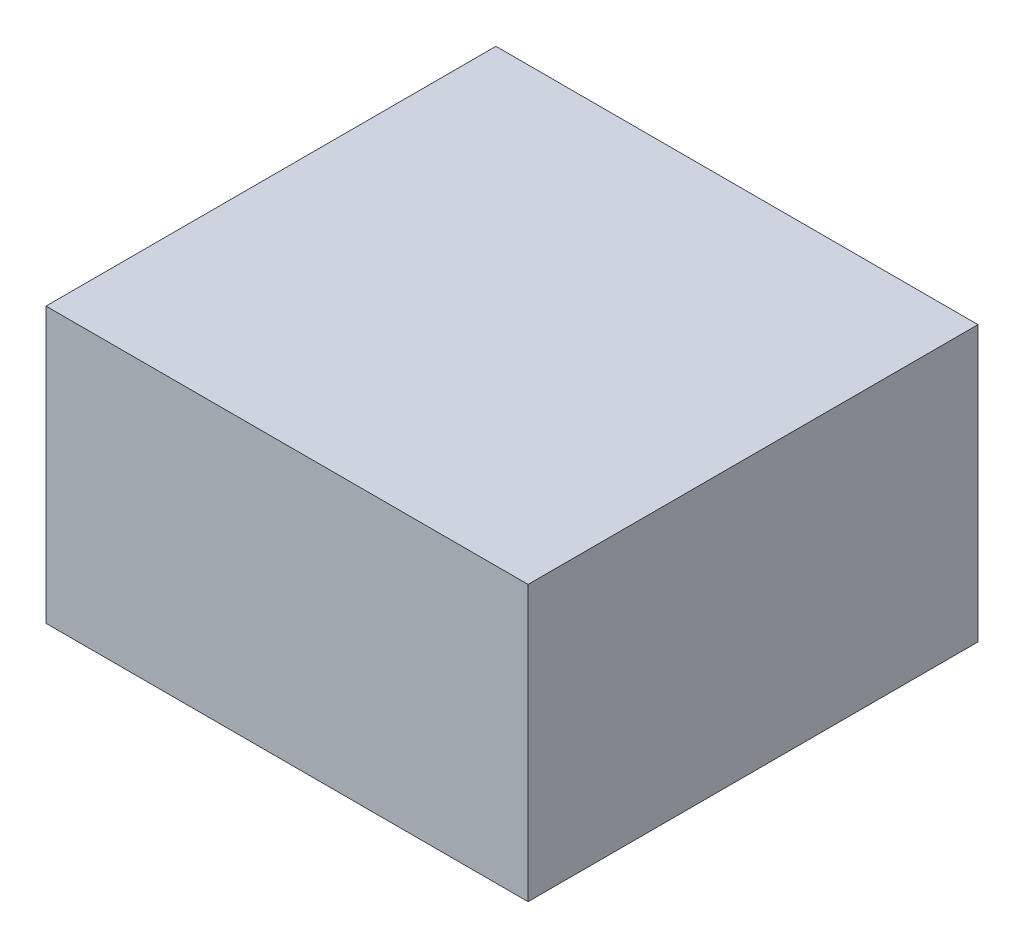
ISO-10303-21;
HEADER;
FILE_DESCRIPTION(('STEP AP214'),'2;1');
FILE_NAME('part.step','',(''),(''),'','','');
FILE_SCHEMA(('AUTOMOTIVE_DESIGN { 1 0 10303 214 1 1 1 1 }'));
ENDSEC;
DATA;
#1=APPLICATION_CONTEXT('core data for automotive mechanical design processes');
#2=APPLICATION_PROTOCOL_DEFINITION('international standard','automotive_design',2000,#1);
#3=PRODUCT_CONTEXT('',#1,'mechanical');
#4=PRODUCT('Part','Part','',(#3));
#5=PRODUCT_RELATED_PRODUCT_CATEGORY('part','',(#4));
#6=PRODUCT_DEFINITION_FORMATION('','',#4);
#7=PRODUCT_DEFINITION_CONTEXT('part definition',#1,'design');
#8=PRODUCT_DEFINITION('design','',#6,#7);
#9=PRODUCT_DEFINITION_SHAPE('','',#8);
#10=(LENGTH_UNIT() NAMED_UNIT(*) SI_UNIT(.MILLI.,.METRE.));
#11=(NAMED_UNIT(*) PLANE_ANGLE_UNIT() SI_UNIT($,.RADIAN.));
#12=(NAMED_UNIT(*) SI_UNIT($,.STERADIAN.) SOLID_ANGLE_UNIT());
#13=UNCERTAINTY_MEASURE_WITH_UNIT(LENGTH_MEASURE(1.E-05),#10,'distance_accuracy_value','');
#14=(GEOMETRIC_REPRESENTATION_CONTEXT(3) GLOBAL_UNCERTAINTY_ASSIGNED_CONTEXT((#13)) GLOBAL_UNIT_ASSIGNED_CONTEXT((#10,
#11,#12)) REPRESENTATION_CONTEXT('',''));
#15=CARTESIAN_POINT('',(0.,0.,0.));
#16=DIRECTION('',(0.,0.,1.));
#17=DIRECTION('',(1.,0.,0.));
#18=AXIS2_PLACEMENT_3D('',#15,#16,#17);
#19=CARTESIAN_POINT('',(75.,85.5,-70.));
#20=DIRECTION('',(-1.,0.,0.));
#21=DIRECTION('',(0.,0.,1.));
#22=AXIS2_PLACEMENT_3D('',#19,#20,#21);
#23=PLANE('',#22);
#24=DIRECTION('',(0.,0.,-1.));
#25=VECTOR('',#24,1.);
#26=CARTESIAN_POINT('',(75.,0.,-70.));
#27=LINE('',#26,#25);
#28=CARTESIAN_POINT('',(75.,0.,70.));
#29=VERTEX_POINT('',#28);
#30=CARTESIAN_POINT('',(75.,0.,-70.));
#31=VERTEX_POINT('',#30);
#32=EDGE_CURVE('E98',#29,#31,#27,.T.);
#33=ORIENTED_EDGE('',*,*,#32,.T.);
#34=DIRECTION('',(0.,-1.,0.));
#35=VECTOR('',#34,1.);
#36=CARTESIAN_POINT('',(75.,85.5,-70.));
#37=LINE('',#36,#35);
#38=CARTESIAN_POINT('',(75.,85.5,-70.));
#39=VERTEX_POINT('',#38);
#40=EDGE_CURVE('E11',#39,#31,#37,.T.);
#41=ORIENTED_EDGE('',*,*,#40,.F.);
#42=DIRECTION('',(0.,0.,-1.));
#43=VECTOR('',#42,1.);
#44=CARTESIAN_POINT('',(75.,85.5,-70.));
#45=LINE('',#44,#43);
#46=CARTESIAN_POINT('',(75.,85.5,70.));
#47=VERTEX_POINT('',#46);
#48=EDGE_CURVE('E86',#47,#39,#45,.T.);
#49=ORIENTED_EDGE('',*,*,#48,.F.);
#50=DIRECTION('',(0.,-1.,0.));
#51=VECTOR('',#50,1.);
#52=CARTESIAN_POINT('',(75.,85.5,70.));
#53=LINE('',#52,#51);
#54=EDGE_CURVE('E94',#47,#29,#53,.T.);
#55=ORIENTED_EDGE('',*,*,#54,.T.);
#56=EDGE_LOOP('',(#33,#41,#49,#55));
#57=FACE_BOUND('',#56,.T.);
#58=ADVANCED_FACE('F35',(#57),#23,.F.);
#59=CARTESIAN_POINT('',(-75.,85.5,-70.));
#60=DIRECTION('',(0.,0.,1.));
#61=DIRECTION('',(1.,0.,0.));
#62=AXIS2_PLACEMENT_3D('',#59,#60,#61);
#63=PLANE('',#62);
#64=DIRECTION('',(-1.,0.,0.));
#65=VECTOR('',#64,1.);
#66=CARTESIAN_POINT('',(-75.,0.,-70.));
#67=LINE('',#66,#65);
#68=CARTESIAN_POINT('',(-75.,0.,-70.));
#69=VERTEX_POINT('',#68);
#70=EDGE_CURVE('E90',#31,#69,#67,.T.);
#71=ORIENTED_EDGE('',*,*,#70,.T.);
#72=DIRECTION('',(0.,-1.,0.));
#73=VECTOR('',#72,1.);
#74=CARTESIAN_POINT('',(-75.,85.5,-70.));
#75=LINE('',#74,#73);
#76=CARTESIAN_POINT('',(-75.,85.5,-70.));
#77=VERTEX_POINT('',#76);
#78=EDGE_CURVE('E43',#77,#69,#75,.T.);
#79=ORIENTED_EDGE('',*,*,#78,.F.);
#80=DIRECTION('',(-1.,0.,0.));
#81=VECTOR('',#80,1.);
#82=CARTESIAN_POINT('',(-75.,85.5,-70.));
#83=LINE('',#82,#81);
#84=EDGE_CURVE('E81',#39,#77,#83,.T.);
#85=ORIENTED_EDGE('',*,*,#84,.F.);
#86=ORIENTED_EDGE('',*,*,#40,.T.);
#87=EDGE_LOOP('',(#71,#79,#85,#86));
#88=FACE_BOUND('',#87,.T.);
#89=ADVANCED_FACE('F89',(#88),#63,.F.);
#90=CARTESIAN_POINT('',(-75.,85.5,-70.));
#91=DIRECTION('',(1.,0.,0.));
#92=DIRECTION('',(0.,0.,-1.));
#93=AXIS2_PLACEMENT_3D('',#90,#91,#92);
#94=PLANE('',#93);
#95=DIRECTION('',(0.,0.,1.));
#96=VECTOR('',#95,1.);
#97=CARTESIAN_POINT('',(-75.,0.,-70.));
#98=LINE('',#97,#96);
#99=CARTESIAN_POINT('',(-75.,0.,70.));
#100=VERTEX_POINT('',#99);
#101=EDGE_CURVE('E68',#69,#100,#98,.T.);
#102=ORIENTED_EDGE('',*,*,#101,.T.);
#103=DIRECTION('',(0.,-1.,0.));
#104=VECTOR('',#103,1.);
#105=CARTESIAN_POINT('',(-75.,85.5,70.));
#106=LINE('',#105,#104);
#107=CARTESIAN_POINT('',(-75.,85.5,70.));
#108=VERTEX_POINT('',#107);
#109=EDGE_CURVE('E91',#108,#100,#106,.T.);
#110=ORIENTED_EDGE('',*,*,#109,.F.);
#111=DIRECTION('',(0.,0.,1.));
#112=VECTOR('',#111,1.);
#113=CARTESIAN_POINT('',(-75.,85.5,-70.));
#114=LINE('',#113,#112);
#115=EDGE_CURVE('E84',#77,#108,#114,.T.);
#116=ORIENTED_EDGE('',*,*,#115,.F.);
#117=ORIENTED_EDGE('',*,*,#78,.T.);
#118=EDGE_LOOP('',(#102,#110,#116,#117));
#119=FACE_BOUND('',#118,.T.);
#120=ADVANCED_FACE('F92',(#119),#94,.F.);
#121=CARTESIAN_POINT('',(-75.,85.5,70.));
#122=DIRECTION('',(0.,0.,-1.));
#123=DIRECTION('',(-1.,0.,0.));
#124=AXIS2_PLACEMENT_3D('',#121,#122,#123);
#125=PLANE('',#124);
#126=DIRECTION('',(1.,0.,0.));
#127=VECTOR('',#126,1.);
#128=CARTESIAN_POINT('',(-75.,0.,70.));
#129=LINE('',#128,#127);
#130=EDGE_CURVE('E74',#100,#29,#129,.T.);
#131=ORIENTED_EDGE('',*,*,#130,.T.);
#132=ORIENTED_EDGE('',*,*,#54,.F.);
#133=DIRECTION('',(1.,0.,0.));
#134=VECTOR('',#133,1.);
#135=CARTESIAN_POINT('',(-75.,85.5,70.));
#136=LINE('',#135,#134);
#137=EDGE_CURVE('E51',#108,#47,#136,.T.);
#138=ORIENTED_EDGE('',*,*,#137,.F.);
#139=ORIENTED_EDGE('',*,*,#109,.T.);
#140=EDGE_LOOP('',(#131,#132,#138,#139));
#141=FACE_BOUND('',#140,.T.);
#142=ADVANCED_FACE('F105',(#141),#125,.F.);
#143=CARTESIAN_POINT('',(0.,85.5,0.));
#144=DIRECTION('',(0.,1.,0.));
#145=DIRECTION('',(0.,0.,1.));
#146=AXIS2_PLACEMENT_3D('',#143,#144,#145);
#147=PLANE('',#146);
#148=ORIENTED_EDGE('',*,*,#48,.T.);
#149=ORIENTED_EDGE('',*,*,#84,.T.);
#150=ORIENTED_EDGE('',*,*,#115,.T.);
#151=ORIENTED_EDGE('',*,*,#137,.T.);
#152=EDGE_LOOP('',(#148,#149,#150,#151));
#153=FACE_BOUND('',#152,.T.);
#154=ADVANCED_FACE('F82',(#153),#147,.T.);
#155=CARTESIAN_POINT('',(0.,0.,0.));
#156=DIRECTION('',(0.,1.,0.));
#157=DIRECTION('',(0.,0.,1.));
#158=AXIS2_PLACEMENT_3D('',#155,#156,#157);
#159=PLANE('',#158);
#160=ORIENTED_EDGE('',*,*,#32,.F.);
#161=ORIENTED_EDGE('',*,*,#130,.F.);
#162=ORIENTED_EDGE('',*,*,#101,.F.);
#163=ORIENTED_EDGE('',*,*,#70,.F.);
#164=EDGE_LOOP('',(#160,#161,#162,#163));
#165=FACE_BOUND('',#164,.T.);
#166=ADVANCED_FACE('F108',(#165),#159,.F.);
#167=CLOSED_SHELL('',(#58,#89,#120,#142,#154,#166));
#168=MANIFOLD_SOLID_BREP('B2',#167);
#169=ADVANCED_BREP_SHAPE_REPRESENTATION('',(#18,#168),#14);
#170=SHAPE_DEFINITION_REPRESENTATION(#9,#169);
ENDSEC;
END-ISO-10303-21;
